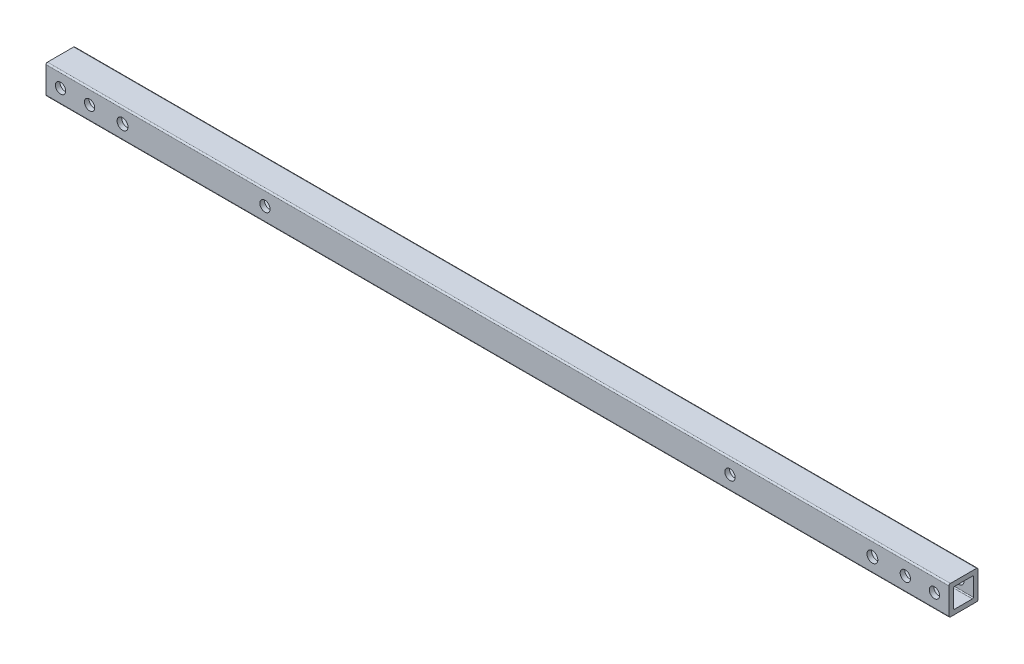
ISO-10303-21;
HEADER;
FILE_DESCRIPTION(('STEP AP214'),'2;1');
FILE_NAME('part.step','',(''),(''),'','','');
FILE_SCHEMA(('AUTOMOTIVE_DESIGN { 1 0 10303 214 1 1 1 1 }'));
ENDSEC;
DATA;
#1=APPLICATION_CONTEXT('core data for automotive mechanical design processes');
#2=APPLICATION_PROTOCOL_DEFINITION('international standard','automotive_design',2000,#1);
#3=PRODUCT_CONTEXT('',#1,'mechanical');
#4=PRODUCT('Part','Part','',(#3));
#5=PRODUCT_RELATED_PRODUCT_CATEGORY('part','',(#4));
#6=PRODUCT_DEFINITION_FORMATION('','',#4);
#7=PRODUCT_DEFINITION_CONTEXT('part definition',#1,'design');
#8=PRODUCT_DEFINITION('design','',#6,#7);
#9=PRODUCT_DEFINITION_SHAPE('','',#8);
#10=(LENGTH_UNIT() NAMED_UNIT(*) SI_UNIT(.MILLI.,.METRE.));
#11=(NAMED_UNIT(*) PLANE_ANGLE_UNIT() SI_UNIT($,.RADIAN.));
#12=(NAMED_UNIT(*) SI_UNIT($,.STERADIAN.) SOLID_ANGLE_UNIT());
#13=UNCERTAINTY_MEASURE_WITH_UNIT(LENGTH_MEASURE(1.E-05),#10,'distance_accuracy_value','');
#14=(GEOMETRIC_REPRESENTATION_CONTEXT(3) GLOBAL_UNCERTAINTY_ASSIGNED_CONTEXT((#13)) GLOBAL_UNIT_ASSIGNED_CONTEXT((#10,
#11,#12)) REPRESENTATION_CONTEXT('',''));
#15=CARTESIAN_POINT('',(0.,0.,0.));
#16=DIRECTION('',(0.,0.,1.));
#17=DIRECTION('',(1.,0.,0.));
#18=AXIS2_PLACEMENT_3D('',#15,#16,#17);
#19=CARTESIAN_POINT('',(295.91,-8.5725,-8.57250000000001));
#20=DIRECTION('',(1.,0.,0.));
#21=DIRECTION('',(0.,0.,-1.));
#22=AXIS2_PLACEMENT_3D('',#19,#20,#21);
#23=PLANE('',#22);
#24=CARTESIAN_POINT('',(295.91,-8.5725,-8.57250000000001));
#25=DIRECTION('',(1.,0.,0.));
#26=DIRECTION('',(0.,0.,-1.));
#27=AXIS2_PLACEMENT_3D('',#24,#25,#26);
#28=CIRCLE('',#27,0.952499999999997);
#29=CARTESIAN_POINT('',(295.91,-9.525,-8.5725));
#30=VERTEX_POINT('',#29);
#31=CARTESIAN_POINT('',(295.91,-8.5725,-9.525));
#32=VERTEX_POINT('',#31);
#33=EDGE_CURVE('E253',#30,#32,#28,.T.);
#34=ORIENTED_EDGE('',*,*,#33,.T.);
#35=DIRECTION('',(0.,1.,0.));
#36=VECTOR('',#35,1.);
#37=CARTESIAN_POINT('',(295.91,-8.5725,-9.525));
#38=LINE('',#37,#36);
#39=CARTESIAN_POINT('',(295.91,8.5725,-9.525));
#40=VERTEX_POINT('',#39);
#41=EDGE_CURVE('E257',#32,#40,#38,.T.);
#42=ORIENTED_EDGE('',*,*,#41,.T.);
#43=CARTESIAN_POINT('',(295.91,8.5725,-8.5725));
#44=DIRECTION('',(1.,0.,0.));
#45=DIRECTION('',(0.,0.,-1.));
#46=AXIS2_PLACEMENT_3D('',#43,#44,#45);
#47=CIRCLE('',#46,0.9525);
#48=CARTESIAN_POINT('',(295.91,9.525,-8.5725));
#49=VERTEX_POINT('',#48);
#50=EDGE_CURVE('E261',#40,#49,#47,.T.);
#51=ORIENTED_EDGE('',*,*,#50,.T.);
#52=DIRECTION('',(0.,0.,1.));
#53=VECTOR('',#52,1.);
#54=CARTESIAN_POINT('',(295.91,9.525,-8.5725));
#55=LINE('',#54,#53);
#56=CARTESIAN_POINT('',(295.91,9.525,8.5725));
#57=VERTEX_POINT('',#56);
#58=EDGE_CURVE('E264',#49,#57,#55,.T.);
#59=ORIENTED_EDGE('',*,*,#58,.T.);
#60=CARTESIAN_POINT('',(295.91,8.5725,8.5725));
#61=DIRECTION('',(1.,0.,0.));
#62=DIRECTION('',(0.,0.,-1.));
#63=AXIS2_PLACEMENT_3D('',#60,#61,#62);
#64=CIRCLE('',#63,0.952500000000002);
#65=CARTESIAN_POINT('',(295.91,8.5725,9.525));
#66=VERTEX_POINT('',#65);
#67=EDGE_CURVE('E267',#57,#66,#64,.T.);
#68=ORIENTED_EDGE('',*,*,#67,.T.);
#69=DIRECTION('',(0.,-1.,0.));
#70=VECTOR('',#69,1.);
#71=CARTESIAN_POINT('',(295.91,-8.5725,9.525));
#72=LINE('',#71,#70);
#73=CARTESIAN_POINT('',(295.91,-8.5725,9.525));
#74=VERTEX_POINT('',#73);
#75=EDGE_CURVE('E270',#66,#74,#72,.T.);
#76=ORIENTED_EDGE('',*,*,#75,.T.);
#77=CARTESIAN_POINT('',(295.91,-8.5725,8.5725));
#78=DIRECTION('',(1.,0.,0.));
#79=DIRECTION('',(0.,0.,-1.));
#80=AXIS2_PLACEMENT_3D('',#77,#78,#79);
#81=CIRCLE('',#80,0.952499999999998);
#82=CARTESIAN_POINT('',(295.91,-9.525,8.5725));
#83=VERTEX_POINT('',#82);
#84=EDGE_CURVE('E273',#74,#83,#81,.T.);
#85=ORIENTED_EDGE('',*,*,#84,.T.);
#86=DIRECTION('',(0.,0.,-1.));
#87=VECTOR('',#86,1.);
#88=CARTESIAN_POINT('',(295.91,-9.525,-8.5725));
#89=LINE('',#88,#87);
#90=EDGE_CURVE('E276',#83,#30,#89,.T.);
#91=ORIENTED_EDGE('',*,*,#90,.T.);
#92=EDGE_LOOP('',(#34,#42,#51,#59,#68,#76,#85,#91));
#93=FACE_BOUND('',#92,.T.);
#94=DIRECTION('',(0.,0.,1.));
#95=VECTOR('',#94,1.);
#96=CARTESIAN_POINT('',(295.91,6.477,-5.8293));
#97=LINE('',#96,#95);
#98=CARTESIAN_POINT('',(295.91,6.477,-5.8293));
#99=VERTEX_POINT('',#98);
#100=CARTESIAN_POINT('',(295.91,6.477,5.8293));
#101=VERTEX_POINT('',#100);
#102=EDGE_CURVE('E170',#99,#101,#97,.T.);
#103=ORIENTED_EDGE('',*,*,#102,.F.);
#104=CARTESIAN_POINT('',(295.91,5.8293,-5.8293));
#105=DIRECTION('',(1.,0.,0.));
#106=DIRECTION('',(0.,0.,-1.));
#107=AXIS2_PLACEMENT_3D('',#104,#105,#106);
#108=CIRCLE('',#107,0.647699999999999);
#109=CARTESIAN_POINT('',(295.91,5.8293,-6.477));
#110=VERTEX_POINT('',#109);
#111=EDGE_CURVE('E161',#110,#99,#108,.T.);
#112=ORIENTED_EDGE('',*,*,#111,.F.);
#113=DIRECTION('',(0.,1.,0.));
#114=VECTOR('',#113,1.);
#115=CARTESIAN_POINT('',(295.91,5.8293,-6.477));
#116=LINE('',#115,#114);
#117=CARTESIAN_POINT('',(295.91,-5.8293,-6.477));
#118=VERTEX_POINT('',#117);
#119=EDGE_CURVE('E204',#118,#110,#116,.T.);
#120=ORIENTED_EDGE('',*,*,#119,.F.);
#121=CARTESIAN_POINT('',(295.91,-5.8293,-5.8293));
#122=DIRECTION('',(1.,0.,0.));
#123=DIRECTION('',(0.,0.,-1.));
#124=AXIS2_PLACEMENT_3D('',#121,#122,#123);
#125=CIRCLE('',#124,0.647699999999999);
#126=CARTESIAN_POINT('',(295.91,-6.477,-5.8293));
#127=VERTEX_POINT('',#126);
#128=EDGE_CURVE('E201',#127,#118,#125,.T.);
#129=ORIENTED_EDGE('',*,*,#128,.F.);
#130=DIRECTION('',(0.,0.,-1.));
#131=VECTOR('',#130,1.);
#132=CARTESIAN_POINT('',(295.91,-6.477,-5.8293));
#133=LINE('',#132,#131);
#134=CARTESIAN_POINT('',(295.91,-6.477,5.8293));
#135=VERTEX_POINT('',#134);
#136=EDGE_CURVE('E198',#135,#127,#133,.T.);
#137=ORIENTED_EDGE('',*,*,#136,.F.);
#138=CARTESIAN_POINT('',(295.91,-5.8293,5.8293));
#139=DIRECTION('',(1.,0.,0.));
#140=DIRECTION('',(0.,0.,-1.));
#141=AXIS2_PLACEMENT_3D('',#138,#139,#140);
#142=CIRCLE('',#141,0.647699999999999);
#143=CARTESIAN_POINT('',(295.91,-5.8293,6.477));
#144=VERTEX_POINT('',#143);
#145=EDGE_CURVE('E195',#144,#135,#142,.T.);
#146=ORIENTED_EDGE('',*,*,#145,.F.);
#147=DIRECTION('',(0.,-1.,0.));
#148=VECTOR('',#147,1.);
#149=CARTESIAN_POINT('',(295.91,5.82929999999999,6.477));
#150=LINE('',#149,#148);
#151=CARTESIAN_POINT('',(295.91,5.82929999999999,6.477));
#152=VERTEX_POINT('',#151);
#153=EDGE_CURVE('E189',#152,#144,#150,.T.);
#154=ORIENTED_EDGE('',*,*,#153,.F.);
#155=CARTESIAN_POINT('',(295.91,5.82929999999999,5.8293));
#156=DIRECTION('',(1.,0.,0.));
#157=DIRECTION('',(0.,0.,-1.));
#158=AXIS2_PLACEMENT_3D('',#155,#156,#157);
#159=CIRCLE('',#158,0.647700000000003);
#160=EDGE_CURVE('E184',#101,#152,#159,.T.);
#161=ORIENTED_EDGE('',*,*,#160,.F.);
#162=EDGE_LOOP('',(#103,#112,#120,#129,#137,#146,#154,#161));
#163=FACE_BOUND('',#162,.T.);
#164=ADVANCED_FACE('F45',(#93,#163),#23,.T.);
#165=CARTESIAN_POINT('',(-295.91,-8.5725,-8.57250000000001));
#166=DIRECTION('',(1.,0.,0.));
#167=DIRECTION('',(0.,0.,-1.));
#168=AXIS2_PLACEMENT_3D('',#165,#166,#167);
#169=PLANE('',#168);
#170=CARTESIAN_POINT('',(-295.91,-8.5725,-8.57250000000001));
#171=DIRECTION('',(1.,0.,0.));
#172=DIRECTION('',(0.,0.,-1.));
#173=AXIS2_PLACEMENT_3D('',#170,#171,#172);
#174=CIRCLE('',#173,0.952499999999997);
#175=CARTESIAN_POINT('',(-295.91,-9.525,-8.5725));
#176=VERTEX_POINT('',#175);
#177=CARTESIAN_POINT('',(-295.91,-8.5725,-9.525));
#178=VERTEX_POINT('',#177);
#179=EDGE_CURVE('E179',#176,#178,#174,.T.);
#180=ORIENTED_EDGE('',*,*,#179,.F.);
#181=DIRECTION('',(0.,0.,-1.));
#182=VECTOR('',#181,1.);
#183=CARTESIAN_POINT('',(-295.91,-9.525,-8.5725));
#184=LINE('',#183,#182);
#185=CARTESIAN_POINT('',(-295.91,-9.525,8.5725));
#186=VERTEX_POINT('',#185);
#187=EDGE_CURVE('E258',#186,#176,#184,.T.);
#188=ORIENTED_EDGE('',*,*,#187,.F.);
#189=CARTESIAN_POINT('',(-295.91,-8.5725,8.5725));
#190=DIRECTION('',(1.,0.,0.));
#191=DIRECTION('',(0.,0.,-1.));
#192=AXIS2_PLACEMENT_3D('',#189,#190,#191);
#193=CIRCLE('',#192,0.952499999999998);
#194=CARTESIAN_POINT('',(-295.91,-8.5725,9.525));
#195=VERTEX_POINT('',#194);
#196=EDGE_CURVE('E298',#195,#186,#193,.T.);
#197=ORIENTED_EDGE('',*,*,#196,.F.);
#198=DIRECTION('',(0.,-1.,0.));
#199=VECTOR('',#198,1.);
#200=CARTESIAN_POINT('',(-295.91,-8.5725,9.525));
#201=LINE('',#200,#199);
#202=CARTESIAN_POINT('',(-295.91,8.5725,9.525));
#203=VERTEX_POINT('',#202);
#204=EDGE_CURVE('E295',#203,#195,#201,.T.);
#205=ORIENTED_EDGE('',*,*,#204,.F.);
#206=CARTESIAN_POINT('',(-295.91,8.5725,8.5725));
#207=DIRECTION('',(1.,0.,0.));
#208=DIRECTION('',(0.,0.,-1.));
#209=AXIS2_PLACEMENT_3D('',#206,#207,#208);
#210=CIRCLE('',#209,0.952500000000002);
#211=CARTESIAN_POINT('',(-295.91,9.525,8.5725));
#212=VERTEX_POINT('',#211);
#213=EDGE_CURVE('E292',#212,#203,#210,.T.);
#214=ORIENTED_EDGE('',*,*,#213,.F.);
#215=DIRECTION('',(0.,0.,1.));
#216=VECTOR('',#215,1.);
#217=CARTESIAN_POINT('',(-295.91,9.525,-8.5725));
#218=LINE('',#217,#216);
#219=CARTESIAN_POINT('',(-295.91,9.525,-8.5725));
#220=VERTEX_POINT('',#219);
#221=EDGE_CURVE('E289',#220,#212,#218,.T.);
#222=ORIENTED_EDGE('',*,*,#221,.F.);
#223=CARTESIAN_POINT('',(-295.91,8.5725,-8.5725));
#224=DIRECTION('',(1.,0.,0.));
#225=DIRECTION('',(0.,0.,-1.));
#226=AXIS2_PLACEMENT_3D('',#223,#224,#225);
#227=CIRCLE('',#226,0.9525);
#228=CARTESIAN_POINT('',(-295.91,8.5725,-9.525));
#229=VERTEX_POINT('',#228);
#230=EDGE_CURVE('E286',#229,#220,#227,.T.);
#231=ORIENTED_EDGE('',*,*,#230,.F.);
#232=DIRECTION('',(0.,1.,0.));
#233=VECTOR('',#232,1.);
#234=CARTESIAN_POINT('',(-295.91,-8.5725,-9.525));
#235=LINE('',#234,#233);
#236=EDGE_CURVE('E283',#178,#229,#235,.T.);
#237=ORIENTED_EDGE('',*,*,#236,.F.);
#238=EDGE_LOOP('',(#180,#188,#197,#205,#214,#222,#231,#237));
#239=FACE_BOUND('',#238,.T.);
#240=CARTESIAN_POINT('',(-295.91,5.8293,-5.8293));
#241=DIRECTION('',(1.,0.,0.));
#242=DIRECTION('',(0.,0.,-1.));
#243=AXIS2_PLACEMENT_3D('',#240,#241,#242);
#244=CIRCLE('',#243,0.647699999999999);
#245=CARTESIAN_POINT('',(-295.91,5.8293,-6.477));
#246=VERTEX_POINT('',#245);
#247=CARTESIAN_POINT('',(-295.91,6.477,-5.8293));
#248=VERTEX_POINT('',#247);
#249=EDGE_CURVE('E71',#246,#248,#244,.T.);
#250=ORIENTED_EDGE('',*,*,#249,.T.);
#251=DIRECTION('',(0.,0.,1.));
#252=VECTOR('',#251,1.);
#253=CARTESIAN_POINT('',(-295.91,6.477,-5.8293));
#254=LINE('',#253,#252);
#255=CARTESIAN_POINT('',(-295.91,6.477,5.8293));
#256=VERTEX_POINT('',#255);
#257=EDGE_CURVE('E177',#248,#256,#254,.T.);
#258=ORIENTED_EDGE('',*,*,#257,.T.);
#259=CARTESIAN_POINT('',(-295.91,5.82929999999999,5.8293));
#260=DIRECTION('',(1.,0.,0.));
#261=DIRECTION('',(0.,0.,-1.));
#262=AXIS2_PLACEMENT_3D('',#259,#260,#261);
#263=CIRCLE('',#262,0.647700000000003);
#264=CARTESIAN_POINT('',(-295.91,5.82929999999999,6.477));
#265=VERTEX_POINT('',#264);
#266=EDGE_CURVE('E212',#256,#265,#263,.T.);
#267=ORIENTED_EDGE('',*,*,#266,.T.);
#268=DIRECTION('',(0.,-1.,0.));
#269=VECTOR('',#268,1.);
#270=CARTESIAN_POINT('',(-295.91,5.82929999999999,6.477));
#271=LINE('',#270,#269);
#272=CARTESIAN_POINT('',(-295.91,-5.8293,6.477));
#273=VERTEX_POINT('',#272);
#274=EDGE_CURVE('E216',#265,#273,#271,.T.);
#275=ORIENTED_EDGE('',*,*,#274,.T.);
#276=CARTESIAN_POINT('',(-295.91,-5.8293,5.8293));
#277=DIRECTION('',(1.,0.,0.));
#278=DIRECTION('',(0.,0.,-1.));
#279=AXIS2_PLACEMENT_3D('',#276,#277,#278);
#280=CIRCLE('',#279,0.647699999999999);
#281=CARTESIAN_POINT('',(-295.91,-6.477,5.8293));
#282=VERTEX_POINT('',#281);
#283=EDGE_CURVE('E220',#273,#282,#280,.T.);
#284=ORIENTED_EDGE('',*,*,#283,.T.);
#285=DIRECTION('',(0.,0.,-1.));
#286=VECTOR('',#285,1.);
#287=CARTESIAN_POINT('',(-295.91,-6.477,-5.8293));
#288=LINE('',#287,#286);
#289=CARTESIAN_POINT('',(-295.91,-6.477,-5.8293));
#290=VERTEX_POINT('',#289);
#291=EDGE_CURVE('E224',#282,#290,#288,.T.);
#292=ORIENTED_EDGE('',*,*,#291,.T.);
#293=CARTESIAN_POINT('',(-295.91,-5.8293,-5.8293));
#294=DIRECTION('',(1.,0.,0.));
#295=DIRECTION('',(0.,0.,-1.));
#296=AXIS2_PLACEMENT_3D('',#293,#294,#295);
#297=CIRCLE('',#296,0.647699999999999);
#298=CARTESIAN_POINT('',(-295.91,-5.8293,-6.477));
#299=VERTEX_POINT('',#298);
#300=EDGE_CURVE('E228',#290,#299,#297,.T.);
#301=ORIENTED_EDGE('',*,*,#300,.T.);
#302=DIRECTION('',(0.,1.,0.));
#303=VECTOR('',#302,1.);
#304=CARTESIAN_POINT('',(-295.91,5.8293,-6.477));
#305=LINE('',#304,#303);
#306=EDGE_CURVE('E171',#299,#246,#305,.T.);
#307=ORIENTED_EDGE('',*,*,#306,.T.);
#308=EDGE_LOOP('',(#250,#258,#267,#275,#284,#292,#301,#307));
#309=FACE_BOUND('',#308,.T.);
#310=ADVANCED_FACE('F453',(#239,#309),#169,.F.);
#311=CARTESIAN_POINT('',(295.91,-8.5725,-8.57250000000001));
#312=DIRECTION('',(-1.,0.,0.));
#313=DIRECTION('',(0.,0.,1.));
#314=AXIS2_PLACEMENT_3D('',#311,#312,#313);
#315=CYLINDRICAL_SURFACE('',#314,0.952499999999997);
#316=ORIENTED_EDGE('',*,*,#179,.T.);
#317=DIRECTION('',(-1.,0.,0.));
#318=VECTOR('',#317,1.);
#319=CARTESIAN_POINT('',(295.91,-8.5725,-9.525));
#320=LINE('',#319,#318);
#321=EDGE_CURVE('E11',#32,#178,#320,.T.);
#322=ORIENTED_EDGE('',*,*,#321,.F.);
#323=ORIENTED_EDGE('',*,*,#33,.F.);
#324=DIRECTION('',(-1.,0.,0.));
#325=VECTOR('',#324,1.);
#326=CARTESIAN_POINT('',(295.91,-9.525,-8.5725));
#327=LINE('',#326,#325);
#328=EDGE_CURVE('E279',#30,#176,#327,.T.);
#329=ORIENTED_EDGE('',*,*,#328,.T.);
#330=EDGE_LOOP('',(#316,#322,#323,#329));
#331=FACE_BOUND('',#330,.T.);
#332=ADVANCED_FACE('F47',(#331),#315,.T.);
#333=CARTESIAN_POINT('',(295.91,-8.5725,-9.525));
#334=DIRECTION('',(0.,0.,1.));
#335=DIRECTION('',(1.,0.,0.));
#336=AXIS2_PLACEMENT_3D('',#333,#334,#335);
#337=PLANE('',#336);
#338=CARTESIAN_POINT('',(245.745,0.,-9.525));
#339=DIRECTION('',(0.,0.,1.));
#340=DIRECTION('',(1.,0.,0.));
#341=AXIS2_PLACEMENT_3D('',#338,#339,#340);
#342=CIRCLE('',#341,3.57124);
#343=CARTESIAN_POINT('',(249.31624,0.,-9.525));
#344=VERTEX_POINT('',#343);
#345=EDGE_CURVE('E527',#344,#344,#342,.T.);
#346=ORIENTED_EDGE('',*,*,#345,.T.);
#347=EDGE_LOOP('',(#346));
#348=FACE_BOUND('',#347,.T.);
#349=CARTESIAN_POINT('',(-245.745,0.,-9.525));
#350=DIRECTION('',(0.,0.,1.));
#351=DIRECTION('',(1.,0.,0.));
#352=AXIS2_PLACEMENT_3D('',#349,#350,#351);
#353=CIRCLE('',#352,3.57124);
#354=CARTESIAN_POINT('',(-242.17376,0.,-9.525));
#355=VERTEX_POINT('',#354);
#356=EDGE_CURVE('E366',#355,#355,#353,.T.);
#357=ORIENTED_EDGE('',*,*,#356,.T.);
#358=EDGE_LOOP('',(#357));
#359=FACE_BOUND('',#358,.T.);
#360=CARTESIAN_POINT('',(-286.385,0.,-9.525));
#361=DIRECTION('',(0.,0.,-1.));
#362=DIRECTION('',(0.,1.,0.));
#363=AXIS2_PLACEMENT_3D('',#360,#361,#362);
#364=CIRCLE('',#363,3.3782);
#365=CARTESIAN_POINT('',(-286.385,3.3782,-9.525));
#366=VERTEX_POINT('',#365);
#367=EDGE_CURVE('E370',#366,#366,#364,.T.);
#368=ORIENTED_EDGE('',*,*,#367,.F.);
#369=EDGE_LOOP('',(#368));
#370=FACE_BOUND('',#369,.T.);
#371=CARTESIAN_POINT('',(-267.335,0.,-9.525));
#372=DIRECTION('',(0.,0.,-1.));
#373=DIRECTION('',(0.,1.,0.));
#374=AXIS2_PLACEMENT_3D('',#371,#372,#373);
#375=CIRCLE('',#374,3.3782);
#376=CARTESIAN_POINT('',(-267.335,3.3782,-9.525));
#377=VERTEX_POINT('',#376);
#378=EDGE_CURVE('E391',#377,#377,#375,.T.);
#379=ORIENTED_EDGE('',*,*,#378,.F.);
#380=EDGE_LOOP('',(#379));
#381=FACE_BOUND('',#380,.T.);
#382=CARTESIAN_POINT('',(-152.4,0.,-9.525));
#383=DIRECTION('',(0.,0.,-1.));
#384=DIRECTION('',(0.,1.,0.));
#385=AXIS2_PLACEMENT_3D('',#382,#383,#384);
#386=CIRCLE('',#385,3.3782);
#387=CARTESIAN_POINT('',(-152.4,3.3782,-9.525));
#388=VERTEX_POINT('',#387);
#389=EDGE_CURVE('E401',#388,#388,#386,.T.);
#390=ORIENTED_EDGE('',*,*,#389,.F.);
#391=EDGE_LOOP('',(#390));
#392=FACE_BOUND('',#391,.T.);
#393=CARTESIAN_POINT('',(286.385,0.,-9.525));
#394=DIRECTION('',(0.,0.,-1.));
#395=DIRECTION('',(0.,1.,0.));
#396=AXIS2_PLACEMENT_3D('',#393,#394,#395);
#397=CIRCLE('',#396,3.3782);
#398=CARTESIAN_POINT('',(286.385,3.3782,-9.525));
#399=VERTEX_POINT('',#398);
#400=EDGE_CURVE('E411',#399,#399,#397,.T.);
#401=ORIENTED_EDGE('',*,*,#400,.F.);
#402=EDGE_LOOP('',(#401));
#403=FACE_BOUND('',#402,.T.);
#404=CARTESIAN_POINT('',(267.335,0.,-9.525));
#405=DIRECTION('',(0.,0.,-1.));
#406=DIRECTION('',(0.,1.,0.));
#407=AXIS2_PLACEMENT_3D('',#404,#405,#406);
#408=CIRCLE('',#407,3.3782);
#409=CARTESIAN_POINT('',(267.335,3.3782,-9.525));
#410=VERTEX_POINT('',#409);
#411=EDGE_CURVE('E421',#410,#410,#408,.T.);
#412=ORIENTED_EDGE('',*,*,#411,.F.);
#413=EDGE_LOOP('',(#412));
#414=FACE_BOUND('',#413,.T.);
#415=CARTESIAN_POINT('',(152.4,0.,-9.525));
#416=DIRECTION('',(0.,0.,-1.));
#417=DIRECTION('',(0.,1.,0.));
#418=AXIS2_PLACEMENT_3D('',#415,#416,#417);
#419=CIRCLE('',#418,3.3782);
#420=CARTESIAN_POINT('',(152.4,3.3782,-9.525));
#421=VERTEX_POINT('',#420);
#422=EDGE_CURVE('E431',#421,#421,#419,.T.);
#423=ORIENTED_EDGE('',*,*,#422,.F.);
#424=EDGE_LOOP('',(#423));
#425=FACE_BOUND('',#424,.T.);
#426=ORIENTED_EDGE('',*,*,#236,.T.);
#427=DIRECTION('',(-1.,0.,0.));
#428=VECTOR('',#427,1.);
#429=CARTESIAN_POINT('',(295.91,8.5725,-9.525));
#430=LINE('',#429,#428);
#431=EDGE_CURVE('E55',#40,#229,#430,.T.);
#432=ORIENTED_EDGE('',*,*,#431,.F.);
#433=ORIENTED_EDGE('',*,*,#41,.F.);
#434=ORIENTED_EDGE('',*,*,#321,.T.);
#435=EDGE_LOOP('',(#426,#432,#433,#434));
#436=FACE_BOUND('',#435,.T.);
#437=ADVANCED_FACE('F516',(#348,#359,#370,#381,#392,#403,#414,#425,#436),#337,.F.);
#438=CARTESIAN_POINT('',(295.91,8.5725,-8.5725));
#439=DIRECTION('',(-1.,0.,0.));
#440=DIRECTION('',(0.,0.,1.));
#441=AXIS2_PLACEMENT_3D('',#438,#439,#440);
#442=CYLINDRICAL_SURFACE('',#441,0.9525);
#443=ORIENTED_EDGE('',*,*,#230,.T.);
#444=DIRECTION('',(-1.,0.,0.));
#445=VECTOR('',#444,1.);
#446=CARTESIAN_POINT('',(295.91,9.525,-8.5725));
#447=LINE('',#446,#445);
#448=EDGE_CURVE('E322',#49,#220,#447,.T.);
#449=ORIENTED_EDGE('',*,*,#448,.F.);
#450=ORIENTED_EDGE('',*,*,#50,.F.);
#451=ORIENTED_EDGE('',*,*,#431,.T.);
#452=EDGE_LOOP('',(#443,#449,#450,#451));
#453=FACE_BOUND('',#452,.T.);
#454=ADVANCED_FACE('F513',(#453),#442,.T.);
#455=CARTESIAN_POINT('',(295.91,9.525,-8.5725));
#456=DIRECTION('',(0.,-1.,0.));
#457=DIRECTION('',(0.,0.,-1.));
#458=AXIS2_PLACEMENT_3D('',#455,#456,#457);
#459=PLANE('',#458);
#460=ORIENTED_EDGE('',*,*,#221,.T.);
#461=DIRECTION('',(-1.,0.,0.));
#462=VECTOR('',#461,1.);
#463=CARTESIAN_POINT('',(295.91,9.525,8.5725));
#464=LINE('',#463,#462);
#465=EDGE_CURVE('E318',#57,#212,#464,.T.);
#466=ORIENTED_EDGE('',*,*,#465,.F.);
#467=ORIENTED_EDGE('',*,*,#58,.F.);
#468=ORIENTED_EDGE('',*,*,#448,.T.);
#469=EDGE_LOOP('',(#460,#466,#467,#468));
#470=FACE_BOUND('',#469,.T.);
#471=ADVANCED_FACE('F509',(#470),#459,.F.);
#472=CARTESIAN_POINT('',(295.91,8.5725,8.5725));
#473=DIRECTION('',(-1.,0.,0.));
#474=DIRECTION('',(0.,0.,1.));
#475=AXIS2_PLACEMENT_3D('',#472,#473,#474);
#476=CYLINDRICAL_SURFACE('',#475,0.952500000000002);
#477=ORIENTED_EDGE('',*,*,#213,.T.);
#478=DIRECTION('',(-1.,0.,0.));
#479=VECTOR('',#478,1.);
#480=CARTESIAN_POINT('',(295.91,8.5725,9.525));
#481=LINE('',#480,#479);
#482=EDGE_CURVE('E314',#66,#203,#481,.T.);
#483=ORIENTED_EDGE('',*,*,#482,.F.);
#484=ORIENTED_EDGE('',*,*,#67,.F.);
#485=ORIENTED_EDGE('',*,*,#465,.T.);
#486=EDGE_LOOP('',(#477,#483,#484,#485));
#487=FACE_BOUND('',#486,.T.);
#488=ADVANCED_FACE('F505',(#487),#476,.T.);
#489=CARTESIAN_POINT('',(295.91,-8.5725,9.525));
#490=DIRECTION('',(0.,0.,-1.));
#491=DIRECTION('',(-1.,0.,0.));
#492=AXIS2_PLACEMENT_3D('',#489,#490,#491);
#493=PLANE('',#492);
#494=CARTESIAN_POINT('',(245.745,0.,9.525));
#495=DIRECTION('',(0.,0.,1.));
#496=DIRECTION('',(1.,0.,0.));
#497=AXIS2_PLACEMENT_3D('',#494,#495,#496);
#498=CIRCLE('',#497,3.57123999999998);
#499=CARTESIAN_POINT('',(249.31624,0.,9.525));
#500=VERTEX_POINT('',#499);
#501=EDGE_CURVE('E742',#500,#500,#498,.T.);
#502=ORIENTED_EDGE('',*,*,#501,.F.);
#503=EDGE_LOOP('',(#502));
#504=FACE_BOUND('',#503,.T.);
#505=CARTESIAN_POINT('',(-245.745,0.,9.525));
#506=DIRECTION('',(0.,0.,1.));
#507=DIRECTION('',(1.,0.,0.));
#508=AXIS2_PLACEMENT_3D('',#505,#506,#507);
#509=CIRCLE('',#508,3.57123999999998);
#510=CARTESIAN_POINT('',(-242.17376,0.,9.525));
#511=VERTEX_POINT('',#510);
#512=EDGE_CURVE('E373',#511,#511,#509,.T.);
#513=ORIENTED_EDGE('',*,*,#512,.F.);
#514=EDGE_LOOP('',(#513));
#515=FACE_BOUND('',#514,.T.);
#516=CARTESIAN_POINT('',(-286.385,0.,9.52500000000001));
#517=DIRECTION('',(0.,0.,-1.));
#518=DIRECTION('',(0.,1.,0.));
#519=AXIS2_PLACEMENT_3D('',#516,#517,#518);
#520=CIRCLE('',#519,3.3782);
#521=CARTESIAN_POINT('',(-286.385,3.3782,9.52500000000001));
#522=VERTEX_POINT('',#521);
#523=EDGE_CURVE('E362',#522,#522,#520,.T.);
#524=ORIENTED_EDGE('',*,*,#523,.T.);
#525=EDGE_LOOP('',(#524));
#526=FACE_BOUND('',#525,.T.);
#527=CARTESIAN_POINT('',(-267.335,0.,9.52500000000001));
#528=DIRECTION('',(0.,0.,-1.));
#529=DIRECTION('',(0.,1.,0.));
#530=AXIS2_PLACEMENT_3D('',#527,#528,#529);
#531=CIRCLE('',#530,3.3782);
#532=CARTESIAN_POINT('',(-267.335,3.3782,9.52500000000001));
#533=VERTEX_POINT('',#532);
#534=EDGE_CURVE('E357',#533,#533,#531,.T.);
#535=ORIENTED_EDGE('',*,*,#534,.T.);
#536=EDGE_LOOP('',(#535));
#537=FACE_BOUND('',#536,.T.);
#538=CARTESIAN_POINT('',(-152.4,0.,9.52500000000001));
#539=DIRECTION('',(0.,0.,-1.));
#540=DIRECTION('',(0.,1.,0.));
#541=AXIS2_PLACEMENT_3D('',#538,#539,#540);
#542=CIRCLE('',#541,3.3782);
#543=CARTESIAN_POINT('',(-152.4,3.3782,9.52500000000001));
#544=VERTEX_POINT('',#543);
#545=EDGE_CURVE('E351',#544,#544,#542,.T.);
#546=ORIENTED_EDGE('',*,*,#545,.T.);
#547=EDGE_LOOP('',(#546));
#548=FACE_BOUND('',#547,.T.);
#549=CARTESIAN_POINT('',(286.385,0.,9.52500000000001));
#550=DIRECTION('',(0.,0.,-1.));
#551=DIRECTION('',(0.,1.,0.));
#552=AXIS2_PLACEMENT_3D('',#549,#550,#551);
#553=CIRCLE('',#552,3.3782);
#554=CARTESIAN_POINT('',(286.385,3.3782,9.52500000000001));
#555=VERTEX_POINT('',#554);
#556=EDGE_CURVE('E345',#555,#555,#553,.T.);
#557=ORIENTED_EDGE('',*,*,#556,.T.);
#558=EDGE_LOOP('',(#557));
#559=FACE_BOUND('',#558,.T.);
#560=CARTESIAN_POINT('',(267.335,0.,9.52500000000001));
#561=DIRECTION('',(0.,0.,-1.));
#562=DIRECTION('',(0.,1.,0.));
#563=AXIS2_PLACEMENT_3D('',#560,#561,#562);
#564=CIRCLE('',#563,3.3782);
#565=CARTESIAN_POINT('',(267.335,3.3782,9.52500000000001));
#566=VERTEX_POINT('',#565);
#567=EDGE_CURVE('E339',#566,#566,#564,.T.);
#568=ORIENTED_EDGE('',*,*,#567,.T.);
#569=EDGE_LOOP('',(#568));
#570=FACE_BOUND('',#569,.T.);
#571=CARTESIAN_POINT('',(152.4,0.,9.52500000000001));
#572=DIRECTION('',(0.,0.,-1.));
#573=DIRECTION('',(0.,1.,0.));
#574=AXIS2_PLACEMENT_3D('',#571,#572,#573);
#575=CIRCLE('',#574,3.3782);
#576=CARTESIAN_POINT('',(152.4,3.3782,9.52500000000001));
#577=VERTEX_POINT('',#576);
#578=EDGE_CURVE('E333',#577,#577,#575,.T.);
#579=ORIENTED_EDGE('',*,*,#578,.T.);
#580=EDGE_LOOP('',(#579));
#581=FACE_BOUND('',#580,.T.);
#582=ORIENTED_EDGE('',*,*,#204,.T.);
#583=DIRECTION('',(-1.,0.,0.));
#584=VECTOR('',#583,1.);
#585=CARTESIAN_POINT('',(295.91,-8.5725,9.525));
#586=LINE('',#585,#584);
#587=EDGE_CURVE('E310',#74,#195,#586,.T.);
#588=ORIENTED_EDGE('',*,*,#587,.F.);
#589=ORIENTED_EDGE('',*,*,#75,.F.);
#590=ORIENTED_EDGE('',*,*,#482,.T.);
#591=EDGE_LOOP('',(#582,#588,#589,#590));
#592=FACE_BOUND('',#591,.T.);
#593=ADVANCED_FACE('F501',(#504,#515,#526,#537,#548,#559,#570,#581,#592),#493,.F.);
#594=CARTESIAN_POINT('',(295.91,-8.5725,8.5725));
#595=DIRECTION('',(-1.,0.,0.));
#596=DIRECTION('',(0.,0.,1.));
#597=AXIS2_PLACEMENT_3D('',#594,#595,#596);
#598=CYLINDRICAL_SURFACE('',#597,0.952499999999998);
#599=ORIENTED_EDGE('',*,*,#196,.T.);
#600=DIRECTION('',(-1.,0.,0.));
#601=VECTOR('',#600,1.);
#602=CARTESIAN_POINT('',(295.91,-9.525,8.5725));
#603=LINE('',#602,#601);
#604=EDGE_CURVE('E306',#83,#186,#603,.T.);
#605=ORIENTED_EDGE('',*,*,#604,.F.);
#606=ORIENTED_EDGE('',*,*,#84,.F.);
#607=ORIENTED_EDGE('',*,*,#587,.T.);
#608=EDGE_LOOP('',(#599,#605,#606,#607));
#609=FACE_BOUND('',#608,.T.);
#610=ADVANCED_FACE('F497',(#609),#598,.T.);
#611=CARTESIAN_POINT('',(295.91,-9.525,-8.5725));
#612=DIRECTION('',(0.,1.,0.));
#613=DIRECTION('',(0.,0.,1.));
#614=AXIS2_PLACEMENT_3D('',#611,#612,#613);
#615=PLANE('',#614);
#616=ORIENTED_EDGE('',*,*,#187,.T.);
#617=ORIENTED_EDGE('',*,*,#328,.F.);
#618=ORIENTED_EDGE('',*,*,#90,.F.);
#619=ORIENTED_EDGE('',*,*,#604,.T.);
#620=EDGE_LOOP('',(#616,#617,#618,#619));
#621=FACE_BOUND('',#620,.T.);
#622=ADVANCED_FACE('F494',(#621),#615,.F.);
#623=CARTESIAN_POINT('',(295.91,5.8293,-5.8293));
#624=DIRECTION('',(-1.,0.,0.));
#625=DIRECTION('',(0.,0.,1.));
#626=AXIS2_PLACEMENT_3D('',#623,#624,#625);
#627=CYLINDRICAL_SURFACE('',#626,0.647699999999999);
#628=ORIENTED_EDGE('',*,*,#249,.F.);
#629=DIRECTION('',(-1.,0.,0.));
#630=VECTOR('',#629,1.);
#631=CARTESIAN_POINT('',(295.91,5.8293,-6.477));
#632=LINE('',#631,#630);
#633=EDGE_CURVE('E165',#110,#246,#632,.T.);
#634=ORIENTED_EDGE('',*,*,#633,.F.);
#635=ORIENTED_EDGE('',*,*,#111,.T.);
#636=DIRECTION('',(-1.,0.,0.));
#637=VECTOR('',#636,1.);
#638=CARTESIAN_POINT('',(295.91,6.477,-5.8293));
#639=LINE('',#638,#637);
#640=EDGE_CURVE('E164',#99,#248,#639,.T.);
#641=ORIENTED_EDGE('',*,*,#640,.T.);
#642=EDGE_LOOP('',(#628,#634,#635,#641));
#643=FACE_BOUND('',#642,.T.);
#644=ADVANCED_FACE('F163',(#643),#627,.F.);
#645=CARTESIAN_POINT('',(295.91,6.477,-5.8293));
#646=DIRECTION('',(0.,-1.,0.));
#647=DIRECTION('',(0.,0.,-1.));
#648=AXIS2_PLACEMENT_3D('',#645,#646,#647);
#649=PLANE('',#648);
#650=ORIENTED_EDGE('',*,*,#257,.F.);
#651=ORIENTED_EDGE('',*,*,#640,.F.);
#652=ORIENTED_EDGE('',*,*,#102,.T.);
#653=DIRECTION('',(-1.,0.,0.));
#654=VECTOR('',#653,1.);
#655=CARTESIAN_POINT('',(295.91,6.477,5.8293));
#656=LINE('',#655,#654);
#657=EDGE_CURVE('E180',#101,#256,#656,.T.);
#658=ORIENTED_EDGE('',*,*,#657,.T.);
#659=EDGE_LOOP('',(#650,#651,#652,#658));
#660=FACE_BOUND('',#659,.T.);
#661=ADVANCED_FACE('F174',(#660),#649,.T.);
#662=CARTESIAN_POINT('',(295.91,5.82929999999999,5.8293));
#663=DIRECTION('',(-1.,0.,0.));
#664=DIRECTION('',(0.,0.,1.));
#665=AXIS2_PLACEMENT_3D('',#662,#663,#664);
#666=CYLINDRICAL_SURFACE('',#665,0.647700000000003);
#667=ORIENTED_EDGE('',*,*,#266,.F.);
#668=ORIENTED_EDGE('',*,*,#657,.F.);
#669=ORIENTED_EDGE('',*,*,#160,.T.);
#670=DIRECTION('',(-1.,0.,0.));
#671=VECTOR('',#670,1.);
#672=CARTESIAN_POINT('',(295.91,5.82929999999999,6.477));
#673=LINE('',#672,#671);
#674=EDGE_CURVE('E248',#152,#265,#673,.T.);
#675=ORIENTED_EDGE('',*,*,#674,.T.);
#676=EDGE_LOOP('',(#667,#668,#669,#675));
#677=FACE_BOUND('',#676,.T.);
#678=ADVANCED_FACE('F473',(#677),#666,.F.);
#679=CARTESIAN_POINT('',(295.91,5.82929999999999,6.477));
#680=DIRECTION('',(0.,0.,-1.));
#681=DIRECTION('',(0.,1.,0.));
#682=AXIS2_PLACEMENT_3D('',#679,#680,#681);
#683=PLANE('',#682);
#684=CARTESIAN_POINT('',(245.745,0.,6.477));
#685=DIRECTION('',(0.,0.,-1.));
#686=DIRECTION('',(0.,1.,0.));
#687=AXIS2_PLACEMENT_3D('',#684,#685,#686);
#688=CIRCLE('',#687,3.57123999999999);
#689=CARTESIAN_POINT('',(245.745,3.57123999999999,6.477));
#690=VERTEX_POINT('',#689);
#691=EDGE_CURVE('E378',#690,#690,#688,.T.);
#692=ORIENTED_EDGE('',*,*,#691,.F.);
#693=EDGE_LOOP('',(#692));
#694=FACE_BOUND('',#693,.T.);
#695=CARTESIAN_POINT('',(-245.745,0.,6.477));
#696=DIRECTION('',(0.,0.,-1.));
#697=DIRECTION('',(0.,1.,0.));
#698=AXIS2_PLACEMENT_3D('',#695,#696,#697);
#699=CIRCLE('',#698,3.57123999999999);
#700=CARTESIAN_POINT('',(-245.745,3.57123999999999,6.477));
#701=VERTEX_POINT('',#700);
#702=EDGE_CURVE('E363',#701,#701,#699,.T.);
#703=ORIENTED_EDGE('',*,*,#702,.F.);
#704=EDGE_LOOP('',(#703));
#705=FACE_BOUND('',#704,.T.);
#706=CARTESIAN_POINT('',(-286.385,0.,6.477));
#707=DIRECTION('',(0.,0.,-1.));
#708=DIRECTION('',(0.,1.,0.));
#709=AXIS2_PLACEMENT_3D('',#706,#707,#708);
#710=CIRCLE('',#709,3.3782);
#711=CARTESIAN_POINT('',(-286.385,3.3782,6.477));
#712=VERTEX_POINT('',#711);
#713=EDGE_CURVE('E361',#712,#712,#710,.T.);
#714=ORIENTED_EDGE('',*,*,#713,.F.);
#715=EDGE_LOOP('',(#714));
#716=FACE_BOUND('',#715,.T.);
#717=CARTESIAN_POINT('',(-267.335,0.,6.477));
#718=DIRECTION('',(0.,0.,-1.));
#719=DIRECTION('',(0.,1.,0.));
#720=AXIS2_PLACEMENT_3D('',#717,#718,#719);
#721=CIRCLE('',#720,3.3782);
#722=CARTESIAN_POINT('',(-267.335,3.3782,6.477));
#723=VERTEX_POINT('',#722);
#724=EDGE_CURVE('E352',#723,#723,#721,.T.);
#725=ORIENTED_EDGE('',*,*,#724,.F.);
#726=EDGE_LOOP('',(#725));
#727=FACE_BOUND('',#726,.T.);
#728=CARTESIAN_POINT('',(-152.4,0.,6.477));
#729=DIRECTION('',(0.,0.,-1.));
#730=DIRECTION('',(0.,1.,0.));
#731=AXIS2_PLACEMENT_3D('',#728,#729,#730);
#732=CIRCLE('',#731,3.3782);
#733=CARTESIAN_POINT('',(-152.4,3.3782,6.477));
#734=VERTEX_POINT('',#733);
#735=EDGE_CURVE('E346',#734,#734,#732,.T.);
#736=ORIENTED_EDGE('',*,*,#735,.F.);
#737=EDGE_LOOP('',(#736));
#738=FACE_BOUND('',#737,.T.);
#739=CARTESIAN_POINT('',(286.385,0.,6.477));
#740=DIRECTION('',(0.,0.,-1.));
#741=DIRECTION('',(0.,1.,0.));
#742=AXIS2_PLACEMENT_3D('',#739,#740,#741);
#743=CIRCLE('',#742,3.3782);
#744=CARTESIAN_POINT('',(286.385,3.3782,6.477));
#745=VERTEX_POINT('',#744);
#746=EDGE_CURVE('E340',#745,#745,#743,.T.);
#747=ORIENTED_EDGE('',*,*,#746,.F.);
#748=EDGE_LOOP('',(#747));
#749=FACE_BOUND('',#748,.T.);
#750=CARTESIAN_POINT('',(267.335,0.,6.477));
#751=DIRECTION('',(0.,0.,-1.));
#752=DIRECTION('',(0.,1.,0.));
#753=AXIS2_PLACEMENT_3D('',#750,#751,#752);
#754=CIRCLE('',#753,3.3782);
#755=CARTESIAN_POINT('',(267.335,3.3782,6.477));
#756=VERTEX_POINT('',#755);
#757=EDGE_CURVE('E338',#756,#756,#754,.T.);
#758=ORIENTED_EDGE('',*,*,#757,.F.);
#759=EDGE_LOOP('',(#758));
#760=FACE_BOUND('',#759,.T.);
#761=CARTESIAN_POINT('',(152.4,0.,6.477));
#762=DIRECTION('',(0.,0.,-1.));
#763=DIRECTION('',(0.,1.,0.));
#764=AXIS2_PLACEMENT_3D('',#761,#762,#763);
#765=CIRCLE('',#764,3.3782);
#766=CARTESIAN_POINT('',(152.4,3.3782,6.477));
#767=VERTEX_POINT('',#766);
#768=EDGE_CURVE('E329',#767,#767,#765,.T.);
#769=ORIENTED_EDGE('',*,*,#768,.F.);
#770=EDGE_LOOP('',(#769));
#771=FACE_BOUND('',#770,.T.);
#772=ORIENTED_EDGE('',*,*,#274,.F.);
#773=ORIENTED_EDGE('',*,*,#674,.F.);
#774=ORIENTED_EDGE('',*,*,#153,.T.);
#775=DIRECTION('',(-1.,0.,0.));
#776=VECTOR('',#775,1.);
#777=CARTESIAN_POINT('',(295.91,-5.8293,6.477));
#778=LINE('',#777,#776);
#779=EDGE_CURVE('E245',#144,#273,#778,.T.);
#780=ORIENTED_EDGE('',*,*,#779,.T.);
#781=EDGE_LOOP('',(#772,#773,#774,#780));
#782=FACE_BOUND('',#781,.T.);
#783=ADVANCED_FACE('F469',(#694,#705,#716,#727,#738,#749,#760,#771,#782),#683,.T.);
#784=CARTESIAN_POINT('',(295.91,-5.8293,5.8293));
#785=DIRECTION('',(-1.,0.,0.));
#786=DIRECTION('',(0.,0.,1.));
#787=AXIS2_PLACEMENT_3D('',#784,#785,#786);
#788=CYLINDRICAL_SURFACE('',#787,0.647699999999999);
#789=ORIENTED_EDGE('',*,*,#283,.F.);
#790=ORIENTED_EDGE('',*,*,#779,.F.);
#791=ORIENTED_EDGE('',*,*,#145,.T.);
#792=DIRECTION('',(-1.,0.,0.));
#793=VECTOR('',#792,1.);
#794=CARTESIAN_POINT('',(295.91,-6.477,5.8293));
#795=LINE('',#794,#793);
#796=EDGE_CURVE('E242',#135,#282,#795,.T.);
#797=ORIENTED_EDGE('',*,*,#796,.T.);
#798=EDGE_LOOP('',(#789,#790,#791,#797));
#799=FACE_BOUND('',#798,.T.);
#800=ADVANCED_FACE('F465',(#799),#788,.F.);
#801=CARTESIAN_POINT('',(295.91,-6.477,-5.8293));
#802=DIRECTION('',(0.,1.,0.));
#803=DIRECTION('',(0.,0.,1.));
#804=AXIS2_PLACEMENT_3D('',#801,#802,#803);
#805=PLANE('',#804);
#806=ORIENTED_EDGE('',*,*,#291,.F.);
#807=ORIENTED_EDGE('',*,*,#796,.F.);
#808=ORIENTED_EDGE('',*,*,#136,.T.);
#809=DIRECTION('',(-1.,0.,0.));
#810=VECTOR('',#809,1.);
#811=CARTESIAN_POINT('',(295.91,-6.477,-5.8293));
#812=LINE('',#811,#810);
#813=EDGE_CURVE('E239',#127,#290,#812,.T.);
#814=ORIENTED_EDGE('',*,*,#813,.T.);
#815=EDGE_LOOP('',(#806,#807,#808,#814));
#816=FACE_BOUND('',#815,.T.);
#817=ADVANCED_FACE('F462',(#816),#805,.T.);
#818=CARTESIAN_POINT('',(295.91,-5.8293,-5.8293));
#819=DIRECTION('',(-1.,0.,0.));
#820=DIRECTION('',(0.,0.,1.));
#821=AXIS2_PLACEMENT_3D('',#818,#819,#820);
#822=CYLINDRICAL_SURFACE('',#821,0.647699999999999);
#823=ORIENTED_EDGE('',*,*,#300,.F.);
#824=ORIENTED_EDGE('',*,*,#813,.F.);
#825=ORIENTED_EDGE('',*,*,#128,.T.);
#826=DIRECTION('',(-1.,0.,0.));
#827=VECTOR('',#826,1.);
#828=CARTESIAN_POINT('',(295.91,-5.8293,-6.477));
#829=LINE('',#828,#827);
#830=EDGE_CURVE('E63',#118,#299,#829,.T.);
#831=ORIENTED_EDGE('',*,*,#830,.T.);
#832=EDGE_LOOP('',(#823,#824,#825,#831));
#833=FACE_BOUND('',#832,.T.);
#834=ADVANCED_FACE('F448',(#833),#822,.F.);
#835=CARTESIAN_POINT('',(295.91,5.8293,-6.477));
#836=DIRECTION('',(0.,0.,1.));
#837=DIRECTION('',(1.,0.,0.));
#838=AXIS2_PLACEMENT_3D('',#835,#836,#837);
#839=PLANE('',#838);
#840=CARTESIAN_POINT('',(245.745,0.,-6.477));
#841=DIRECTION('',(0.,0.,1.));
#842=DIRECTION('',(1.,0.,0.));
#843=AXIS2_PLACEMENT_3D('',#840,#841,#842);
#844=CIRCLE('',#843,3.57123999999999);
#845=CARTESIAN_POINT('',(249.31624,0.,-6.477));
#846=VERTEX_POINT('',#845);
#847=EDGE_CURVE('E49',#846,#846,#844,.T.);
#848=ORIENTED_EDGE('',*,*,#847,.F.);
#849=EDGE_LOOP('',(#848));
#850=FACE_BOUND('',#849,.T.);
#851=CARTESIAN_POINT('',(-245.745,0.,-6.477));
#852=DIRECTION('',(0.,0.,1.));
#853=DIRECTION('',(1.,0.,0.));
#854=AXIS2_PLACEMENT_3D('',#851,#852,#853);
#855=CIRCLE('',#854,3.57123999999999);
#856=CARTESIAN_POINT('',(-242.17376,0.,-6.477));
#857=VERTEX_POINT('',#856);
#858=EDGE_CURVE('E365',#857,#857,#855,.T.);
#859=ORIENTED_EDGE('',*,*,#858,.F.);
#860=EDGE_LOOP('',(#859));
#861=FACE_BOUND('',#860,.T.);
#862=CARTESIAN_POINT('',(-286.385,0.,-6.477));
#863=DIRECTION('',(0.,0.,1.));
#864=DIRECTION('',(1.,0.,0.));
#865=AXIS2_PLACEMENT_3D('',#862,#863,#864);
#866=CIRCLE('',#865,3.3782);
#867=CARTESIAN_POINT('',(-283.0068,0.,-6.477));
#868=VERTEX_POINT('',#867);
#869=EDGE_CURVE('E358',#868,#868,#866,.T.);
#870=ORIENTED_EDGE('',*,*,#869,.F.);
#871=EDGE_LOOP('',(#870));
#872=FACE_BOUND('',#871,.T.);
#873=CARTESIAN_POINT('',(-267.335,0.,-6.477));
#874=DIRECTION('',(0.,0.,1.));
#875=DIRECTION('',(1.,0.,0.));
#876=AXIS2_PLACEMENT_3D('',#873,#874,#875);
#877=CIRCLE('',#876,3.3782);
#878=CARTESIAN_POINT('',(-263.9568,0.,-6.477));
#879=VERTEX_POINT('',#878);
#880=EDGE_CURVE('E356',#879,#879,#877,.T.);
#881=ORIENTED_EDGE('',*,*,#880,.F.);
#882=EDGE_LOOP('',(#881));
#883=FACE_BOUND('',#882,.T.);
#884=CARTESIAN_POINT('',(-152.4,0.,-6.477));
#885=DIRECTION('',(0.,0.,1.));
#886=DIRECTION('',(1.,0.,0.));
#887=AXIS2_PLACEMENT_3D('',#884,#885,#886);
#888=CIRCLE('',#887,3.3782);
#889=CARTESIAN_POINT('',(-149.0218,0.,-6.477));
#890=VERTEX_POINT('',#889);
#891=EDGE_CURVE('E350',#890,#890,#888,.T.);
#892=ORIENTED_EDGE('',*,*,#891,.F.);
#893=EDGE_LOOP('',(#892));
#894=FACE_BOUND('',#893,.T.);
#895=CARTESIAN_POINT('',(286.385,0.,-6.477));
#896=DIRECTION('',(0.,0.,1.));
#897=DIRECTION('',(1.,0.,0.));
#898=AXIS2_PLACEMENT_3D('',#895,#896,#897);
#899=CIRCLE('',#898,3.3782);
#900=CARTESIAN_POINT('',(289.7632,0.,-6.477));
#901=VERTEX_POINT('',#900);
#902=EDGE_CURVE('E344',#901,#901,#899,.T.);
#903=ORIENTED_EDGE('',*,*,#902,.F.);
#904=EDGE_LOOP('',(#903));
#905=FACE_BOUND('',#904,.T.);
#906=CARTESIAN_POINT('',(267.335,0.,-6.477));
#907=DIRECTION('',(0.,0.,1.));
#908=DIRECTION('',(1.,0.,0.));
#909=AXIS2_PLACEMENT_3D('',#906,#907,#908);
#910=CIRCLE('',#909,3.3782);
#911=CARTESIAN_POINT('',(270.7132,0.,-6.477));
#912=VERTEX_POINT('',#911);
#913=EDGE_CURVE('E334',#912,#912,#910,.T.);
#914=ORIENTED_EDGE('',*,*,#913,.F.);
#915=EDGE_LOOP('',(#914));
#916=FACE_BOUND('',#915,.T.);
#917=CARTESIAN_POINT('',(152.4,0.,-6.477));
#918=DIRECTION('',(0.,0.,1.));
#919=DIRECTION('',(1.,0.,0.));
#920=AXIS2_PLACEMENT_3D('',#917,#918,#919);
#921=CIRCLE('',#920,3.3782);
#922=CARTESIAN_POINT('',(155.7782,0.,-6.477));
#923=VERTEX_POINT('',#922);
#924=EDGE_CURVE('E209',#923,#923,#921,.T.);
#925=ORIENTED_EDGE('',*,*,#924,.F.);
#926=EDGE_LOOP('',(#925));
#927=FACE_BOUND('',#926,.T.);
#928=ORIENTED_EDGE('',*,*,#306,.F.);
#929=ORIENTED_EDGE('',*,*,#830,.F.);
#930=ORIENTED_EDGE('',*,*,#119,.T.);
#931=ORIENTED_EDGE('',*,*,#633,.T.);
#932=EDGE_LOOP('',(#928,#929,#930,#931));
#933=FACE_BOUND('',#932,.T.);
#934=ADVANCED_FACE('F445',(#850,#861,#872,#883,#894,#905,#916,#927,#933),#839,.T.);
#935=CARTESIAN_POINT('',(152.4,0.,-9.525));
#936=DIRECTION('',(0.,0.,-1.));
#937=DIRECTION('',(0.,1.,0.));
#938=AXIS2_PLACEMENT_3D('',#935,#936,#937);
#939=CYLINDRICAL_SURFACE('',#938,3.3782);
#940=ORIENTED_EDGE('',*,*,#768,.T.);
#941=EDGE_LOOP('',(#940));
#942=FACE_BOUND('',#941,.T.);
#943=ORIENTED_EDGE('',*,*,#578,.F.);
#944=EDGE_LOOP('',(#943));
#945=FACE_BOUND('',#944,.T.);
#946=ADVANCED_FACE('F447',(#942,#945),#939,.F.);
#947=ORIENTED_EDGE('',*,*,#924,.T.);
#948=EDGE_LOOP('',(#947));
#949=FACE_BOUND('',#948,.T.);
#950=ORIENTED_EDGE('',*,*,#422,.T.);
#951=EDGE_LOOP('',(#950));
#952=FACE_BOUND('',#951,.T.);
#953=ADVANCED_FACE('F442',(#949,#952),#939,.F.);
#954=CARTESIAN_POINT('',(267.335,0.,-9.525));
#955=DIRECTION('',(0.,0.,-1.));
#956=DIRECTION('',(0.,1.,0.));
#957=AXIS2_PLACEMENT_3D('',#954,#955,#956);
#958=CYLINDRICAL_SURFACE('',#957,3.3782);
#959=ORIENTED_EDGE('',*,*,#913,.T.);
#960=EDGE_LOOP('',(#959));
#961=FACE_BOUND('',#960,.T.);
#962=ORIENTED_EDGE('',*,*,#411,.T.);
#963=EDGE_LOOP('',(#962));
#964=FACE_BOUND('',#963,.T.);
#965=ADVANCED_FACE('F565',(#961,#964),#958,.F.);
#966=ORIENTED_EDGE('',*,*,#757,.T.);
#967=EDGE_LOOP('',(#966));
#968=FACE_BOUND('',#967,.T.);
#969=ORIENTED_EDGE('',*,*,#567,.F.);
#970=EDGE_LOOP('',(#969));
#971=FACE_BOUND('',#970,.T.);
#972=ADVANCED_FACE('F571',(#968,#971),#958,.F.);
#973=CARTESIAN_POINT('',(286.385,0.,-9.525));
#974=DIRECTION('',(0.,0.,-1.));
#975=DIRECTION('',(0.,1.,0.));
#976=AXIS2_PLACEMENT_3D('',#973,#974,#975);
#977=CYLINDRICAL_SURFACE('',#976,3.3782);
#978=ORIENTED_EDGE('',*,*,#746,.T.);
#979=EDGE_LOOP('',(#978));
#980=FACE_BOUND('',#979,.T.);
#981=ORIENTED_EDGE('',*,*,#556,.F.);
#982=EDGE_LOOP('',(#981));
#983=FACE_BOUND('',#982,.T.);
#984=ADVANCED_FACE('F624',(#980,#983),#977,.F.);
#985=ORIENTED_EDGE('',*,*,#902,.T.);
#986=EDGE_LOOP('',(#985));
#987=FACE_BOUND('',#986,.T.);
#988=ORIENTED_EDGE('',*,*,#400,.T.);
#989=EDGE_LOOP('',(#988));
#990=FACE_BOUND('',#989,.T.);
#991=ADVANCED_FACE('F633',(#987,#990),#977,.F.);
#992=CARTESIAN_POINT('',(-152.4,0.,-9.525));
#993=DIRECTION('',(0.,0.,-1.));
#994=DIRECTION('',(0.,1.,0.));
#995=AXIS2_PLACEMENT_3D('',#992,#993,#994);
#996=CYLINDRICAL_SURFACE('',#995,3.3782);
#997=ORIENTED_EDGE('',*,*,#735,.T.);
#998=EDGE_LOOP('',(#997));
#999=FACE_BOUND('',#998,.T.);
#1000=ORIENTED_EDGE('',*,*,#545,.F.);
#1001=EDGE_LOOP('',(#1000));
#1002=FACE_BOUND('',#1001,.T.);
#1003=ADVANCED_FACE('F642',(#999,#1002),#996,.F.);
#1004=ORIENTED_EDGE('',*,*,#891,.T.);
#1005=EDGE_LOOP('',(#1004));
#1006=FACE_BOUND('',#1005,.T.);
#1007=ORIENTED_EDGE('',*,*,#389,.T.);
#1008=EDGE_LOOP('',(#1007));
#1009=FACE_BOUND('',#1008,.T.);
#1010=ADVANCED_FACE('F651',(#1006,#1009),#996,.F.);
#1011=CARTESIAN_POINT('',(-267.335,0.,-9.525));
#1012=DIRECTION('',(0.,0.,-1.));
#1013=DIRECTION('',(0.,1.,0.));
#1014=AXIS2_PLACEMENT_3D('',#1011,#1012,#1013);
#1015=CYLINDRICAL_SURFACE('',#1014,3.3782);
#1016=ORIENTED_EDGE('',*,*,#724,.T.);
#1017=EDGE_LOOP('',(#1016));
#1018=FACE_BOUND('',#1017,.T.);
#1019=ORIENTED_EDGE('',*,*,#534,.F.);
#1020=EDGE_LOOP('',(#1019));
#1021=FACE_BOUND('',#1020,.T.);
#1022=ADVANCED_FACE('F661',(#1018,#1021),#1015,.F.);
#1023=ORIENTED_EDGE('',*,*,#880,.T.);
#1024=EDGE_LOOP('',(#1023));
#1025=FACE_BOUND('',#1024,.T.);
#1026=ORIENTED_EDGE('',*,*,#378,.T.);
#1027=EDGE_LOOP('',(#1026));
#1028=FACE_BOUND('',#1027,.T.);
#1029=ADVANCED_FACE('F670',(#1025,#1028),#1015,.F.);
#1030=CARTESIAN_POINT('',(-286.385,0.,-9.525));
#1031=DIRECTION('',(0.,0.,-1.));
#1032=DIRECTION('',(0.,1.,0.));
#1033=AXIS2_PLACEMENT_3D('',#1030,#1031,#1032);
#1034=CYLINDRICAL_SURFACE('',#1033,3.3782);
#1035=ORIENTED_EDGE('',*,*,#869,.T.);
#1036=EDGE_LOOP('',(#1035));
#1037=FACE_BOUND('',#1036,.T.);
#1038=ORIENTED_EDGE('',*,*,#367,.T.);
#1039=EDGE_LOOP('',(#1038));
#1040=FACE_BOUND('',#1039,.T.);
#1041=ADVANCED_FACE('F680',(#1037,#1040),#1034,.F.);
#1042=ORIENTED_EDGE('',*,*,#713,.T.);
#1043=EDGE_LOOP('',(#1042));
#1044=FACE_BOUND('',#1043,.T.);
#1045=ORIENTED_EDGE('',*,*,#523,.F.);
#1046=EDGE_LOOP('',(#1045));
#1047=FACE_BOUND('',#1046,.T.);
#1048=ADVANCED_FACE('F688',(#1044,#1047),#1034,.F.);
#1049=CARTESIAN_POINT('',(-245.745,0.,9.525));
#1050=DIRECTION('',(0.,0.,1.));
#1051=DIRECTION('',(1.,0.,0.));
#1052=AXIS2_PLACEMENT_3D('',#1049,#1050,#1051);
#1053=CYLINDRICAL_SURFACE('',#1052,3.57123999999999);
#1054=ORIENTED_EDGE('',*,*,#702,.T.);
#1055=EDGE_LOOP('',(#1054));
#1056=FACE_BOUND('',#1055,.T.);
#1057=ORIENTED_EDGE('',*,*,#512,.T.);
#1058=EDGE_LOOP('',(#1057));
#1059=FACE_BOUND('',#1058,.T.);
#1060=ADVANCED_FACE('F697',(#1056,#1059),#1053,.F.);
#1061=ORIENTED_EDGE('',*,*,#858,.T.);
#1062=EDGE_LOOP('',(#1061));
#1063=FACE_BOUND('',#1062,.T.);
#1064=ORIENTED_EDGE('',*,*,#356,.F.);
#1065=EDGE_LOOP('',(#1064));
#1066=FACE_BOUND('',#1065,.T.);
#1067=ADVANCED_FACE('F706',(#1063,#1066),#1053,.F.);
#1068=CARTESIAN_POINT('',(245.745,0.,9.525));
#1069=DIRECTION('',(0.,0.,1.));
#1070=DIRECTION('',(1.,0.,0.));
#1071=AXIS2_PLACEMENT_3D('',#1068,#1069,#1070);
#1072=CYLINDRICAL_SURFACE('',#1071,3.57123999999999);
#1073=ORIENTED_EDGE('',*,*,#847,.T.);
#1074=EDGE_LOOP('',(#1073));
#1075=FACE_BOUND('',#1074,.T.);
#1076=ORIENTED_EDGE('',*,*,#345,.F.);
#1077=EDGE_LOOP('',(#1076));
#1078=FACE_BOUND('',#1077,.T.);
#1079=ADVANCED_FACE('F714',(#1075,#1078),#1072,.F.);
#1080=ORIENTED_EDGE('',*,*,#691,.T.);
#1081=EDGE_LOOP('',(#1080));
#1082=FACE_BOUND('',#1081,.T.);
#1083=ORIENTED_EDGE('',*,*,#501,.T.);
#1084=EDGE_LOOP('',(#1083));
#1085=FACE_BOUND('',#1084,.T.);
#1086=ADVANCED_FACE('F722',(#1082,#1085),#1072,.F.);
#1087=CLOSED_SHELL('',(#164,#310,#332,#437,#454,#471,#488,#593,#610,#622,#644,#661,#678,#783,
#800,#817,#834,#934,#946,#953,#965,#972,#984,#991,#1003,#1010,#1022,#1029,#1041,#1048,#1060,
#1067,#1079,#1086));
#1088=MANIFOLD_SOLID_BREP('B2',#1087);
#1089=ADVANCED_BREP_SHAPE_REPRESENTATION('',(#18,#1088),#14);
#1090=SHAPE_DEFINITION_REPRESENTATION(#9,#1089);
ENDSEC;
END-ISO-10303-21;
